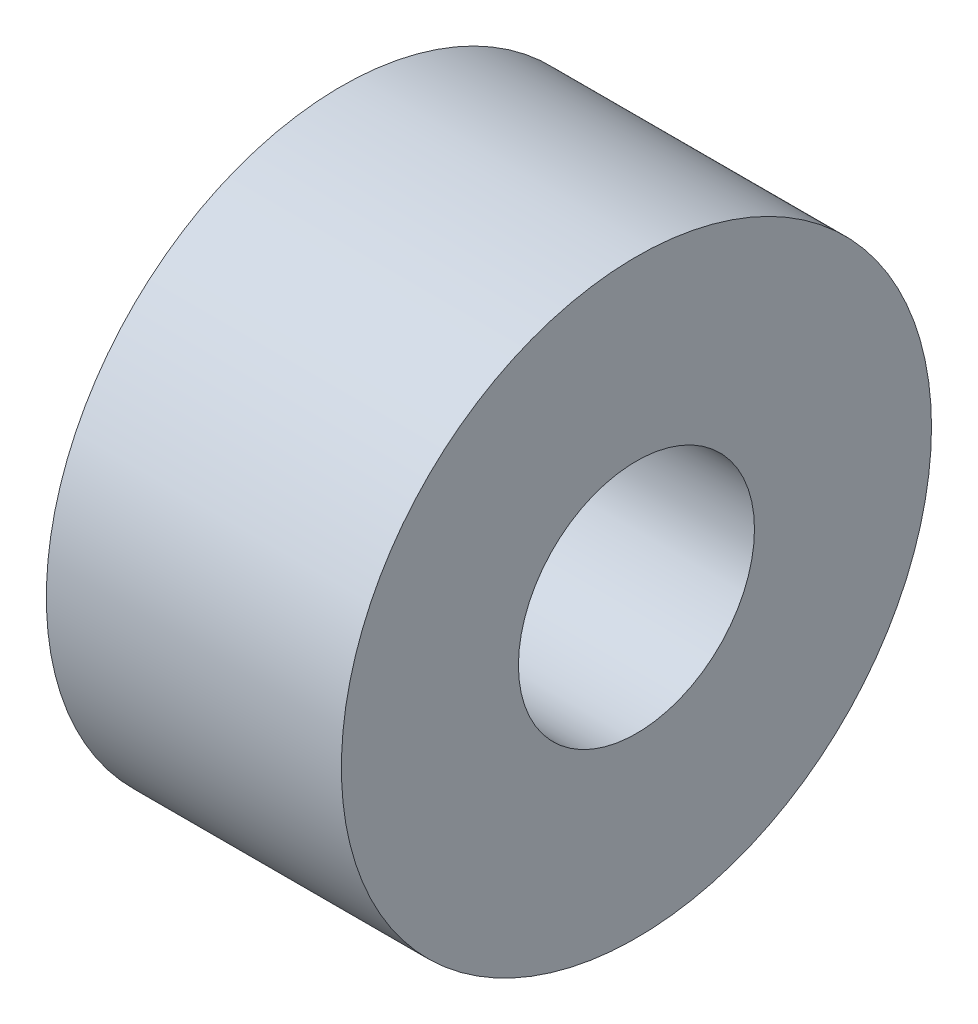
ISO-10303-21;
HEADER;
FILE_DESCRIPTION(('STEP AP214'),'2;1');
FILE_NAME('part.step','',(''),(''),'','','');
FILE_SCHEMA(('AUTOMOTIVE_DESIGN { 1 0 10303 214 1 1 1 1 }'));
ENDSEC;
DATA;
#1=APPLICATION_CONTEXT('core data for automotive mechanical design processes');
#2=APPLICATION_PROTOCOL_DEFINITION('international standard','automotive_design',2000,#1);
#3=PRODUCT_CONTEXT('',#1,'mechanical');
#4=PRODUCT('Part','Part','',(#3));
#5=PRODUCT_RELATED_PRODUCT_CATEGORY('part','',(#4));
#6=PRODUCT_DEFINITION_FORMATION('','',#4);
#7=PRODUCT_DEFINITION_CONTEXT('part definition',#1,'design');
#8=PRODUCT_DEFINITION('design','',#6,#7);
#9=PRODUCT_DEFINITION_SHAPE('','',#8);
#10=(LENGTH_UNIT() NAMED_UNIT(*) SI_UNIT(.MILLI.,.METRE.));
#11=(NAMED_UNIT(*) PLANE_ANGLE_UNIT() SI_UNIT($,.RADIAN.));
#12=(NAMED_UNIT(*) SI_UNIT($,.STERADIAN.) SOLID_ANGLE_UNIT());
#13=UNCERTAINTY_MEASURE_WITH_UNIT(LENGTH_MEASURE(1.E-05),#10,'distance_accuracy_value','');
#14=(GEOMETRIC_REPRESENTATION_CONTEXT(3) GLOBAL_UNCERTAINTY_ASSIGNED_CONTEXT((#13)) GLOBAL_UNIT_ASSIGNED_CONTEXT((#10,
#11,#12)) REPRESENTATION_CONTEXT('',''));
#15=CARTESIAN_POINT('',(0.,0.,0.));
#16=DIRECTION('',(0.,0.,1.));
#17=DIRECTION('',(1.,0.,0.));
#18=AXIS2_PLACEMENT_3D('',#15,#16,#17);
#19=CARTESIAN_POINT('',(10.,0.,0.));
#20=DIRECTION('',(1.,0.,0.));
#21=DIRECTION('',(0.,0.,-1.));
#22=AXIS2_PLACEMENT_3D('',#19,#20,#21);
#23=PLANE('',#22);
#24=CARTESIAN_POINT('',(10.,0.,0.));
#25=DIRECTION('',(1.,0.,0.));
#26=DIRECTION('',(0.,0.,-1.));
#27=AXIS2_PLACEMENT_3D('',#24,#25,#26);
#28=CIRCLE('',#27,10.);
#29=CARTESIAN_POINT('',(10.,0.,-10.));
#30=VERTEX_POINT('',#29);
#31=EDGE_CURVE('E10',#30,#30,#28,.T.);
#32=ORIENTED_EDGE('',*,*,#31,.T.);
#33=EDGE_LOOP('',(#32));
#34=FACE_BOUND('',#33,.T.);
#35=CARTESIAN_POINT('',(10.,0.,0.));
#36=DIRECTION('',(1.,0.,0.));
#37=DIRECTION('',(0.,0.,-1.));
#38=AXIS2_PLACEMENT_3D('',#35,#36,#37);
#39=CIRCLE('',#38,4.);
#40=CARTESIAN_POINT('',(10.,0.,-4.));
#41=VERTEX_POINT('',#40);
#42=EDGE_CURVE('E41',#41,#41,#39,.T.);
#43=ORIENTED_EDGE('',*,*,#42,.F.);
#44=EDGE_LOOP('',(#43));
#45=FACE_BOUND('',#44,.T.);
#46=ADVANCED_FACE('F30',(#34,#45),#23,.T.);
#47=CARTESIAN_POINT('',(0.,0.,0.));
#48=DIRECTION('',(1.,0.,0.));
#49=DIRECTION('',(0.,0.,-1.));
#50=AXIS2_PLACEMENT_3D('',#47,#48,#49);
#51=PLANE('',#50);
#52=CARTESIAN_POINT('',(0.,0.,0.));
#53=DIRECTION('',(1.,0.,0.));
#54=DIRECTION('',(0.,0.,-1.));
#55=AXIS2_PLACEMENT_3D('',#52,#53,#54);
#56=CIRCLE('',#55,10.);
#57=CARTESIAN_POINT('',(0.,0.,-10.));
#58=VERTEX_POINT('',#57);
#59=EDGE_CURVE('E34',#58,#58,#56,.T.);
#60=ORIENTED_EDGE('',*,*,#59,.F.);
#61=EDGE_LOOP('',(#60));
#62=FACE_BOUND('',#61,.T.);
#63=CARTESIAN_POINT('',(0.,0.,0.));
#64=DIRECTION('',(1.,0.,0.));
#65=DIRECTION('',(0.,0.,-1.));
#66=AXIS2_PLACEMENT_3D('',#63,#64,#65);
#67=CIRCLE('',#66,4.);
#68=CARTESIAN_POINT('',(0.,0.,-4.));
#69=VERTEX_POINT('',#68);
#70=EDGE_CURVE('E43',#69,#69,#67,.T.);
#71=ORIENTED_EDGE('',*,*,#70,.T.);
#72=EDGE_LOOP('',(#71));
#73=FACE_BOUND('',#72,.T.);
#74=ADVANCED_FACE('F53',(#62,#73),#51,.F.);
#75=CARTESIAN_POINT('',(10.,0.,0.));
#76=DIRECTION('',(-1.,0.,0.));
#77=DIRECTION('',(0.,0.,1.));
#78=AXIS2_PLACEMENT_3D('',#75,#76,#77);
#79=CYLINDRICAL_SURFACE('',#78,10.);
#80=ORIENTED_EDGE('',*,*,#31,.F.);
#81=EDGE_LOOP('',(#80));
#82=FACE_BOUND('',#81,.T.);
#83=ORIENTED_EDGE('',*,*,#59,.T.);
#84=EDGE_LOOP('',(#83));
#85=FACE_BOUND('',#84,.T.);
#86=ADVANCED_FACE('F32',(#82,#85),#79,.T.);
#87=CARTESIAN_POINT('',(10.,0.,0.));
#88=DIRECTION('',(-1.,0.,0.));
#89=DIRECTION('',(0.,0.,1.));
#90=AXIS2_PLACEMENT_3D('',#87,#88,#89);
#91=CYLINDRICAL_SURFACE('',#90,4.);
#92=ORIENTED_EDGE('',*,*,#42,.T.);
#93=EDGE_LOOP('',(#92));
#94=FACE_BOUND('',#93,.T.);
#95=ORIENTED_EDGE('',*,*,#70,.F.);
#96=EDGE_LOOP('',(#95));
#97=FACE_BOUND('',#96,.T.);
#98=ADVANCED_FACE('F49',(#94,#97),#91,.F.);
#99=CLOSED_SHELL('',(#46,#74,#86,#98));
#100=MANIFOLD_SOLID_BREP('B2',#99);
#101=ADVANCED_BREP_SHAPE_REPRESENTATION('',(#18,#100),#14);
#102=SHAPE_DEFINITION_REPRESENTATION(#9,#101);
ENDSEC;
END-ISO-10303-21;
